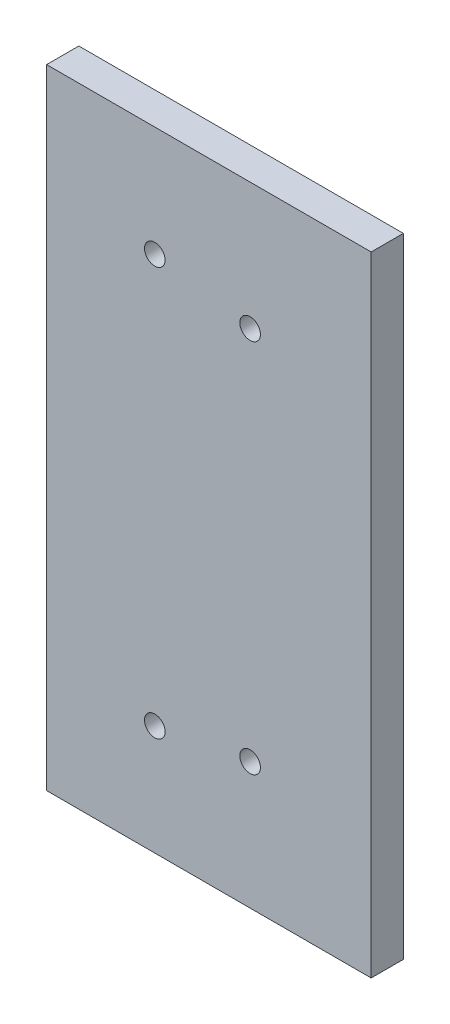
ISO-10303-21;
HEADER;
FILE_DESCRIPTION(('STEP AP214'),'2;1');
FILE_NAME('part.step','',(''),(''),'','','');
FILE_SCHEMA(('AUTOMOTIVE_DESIGN { 1 0 10303 214 1 1 1 1 }'));
ENDSEC;
DATA;
#1=APPLICATION_CONTEXT('core data for automotive mechanical design processes');
#2=APPLICATION_PROTOCOL_DEFINITION('international standard','automotive_design',2000,#1);
#3=PRODUCT_CONTEXT('',#1,'mechanical');
#4=PRODUCT('Part','Part','',(#3));
#5=PRODUCT_RELATED_PRODUCT_CATEGORY('part','',(#4));
#6=PRODUCT_DEFINITION_FORMATION('','',#4);
#7=PRODUCT_DEFINITION_CONTEXT('part definition',#1,'design');
#8=PRODUCT_DEFINITION('design','',#6,#7);
#9=PRODUCT_DEFINITION_SHAPE('','',#8);
#10=(LENGTH_UNIT() NAMED_UNIT(*) SI_UNIT(.MILLI.,.METRE.));
#11=(NAMED_UNIT(*) PLANE_ANGLE_UNIT() SI_UNIT($,.RADIAN.));
#12=(NAMED_UNIT(*) SI_UNIT($,.STERADIAN.) SOLID_ANGLE_UNIT());
#13=UNCERTAINTY_MEASURE_WITH_UNIT(LENGTH_MEASURE(1.E-05),#10,'distance_accuracy_value','');
#14=(GEOMETRIC_REPRESENTATION_CONTEXT(3) GLOBAL_UNCERTAINTY_ASSIGNED_CONTEXT((#13)) GLOBAL_UNIT_ASSIGNED_CONTEXT((#10,
#11,#12)) REPRESENTATION_CONTEXT('',''));
#15=CARTESIAN_POINT('',(0.,0.,0.));
#16=DIRECTION('',(0.,0.,1.));
#17=DIRECTION('',(1.,0.,0.));
#18=AXIS2_PLACEMENT_3D('',#15,#16,#17);
#19=CARTESIAN_POINT('',(0.,0.,1.5875));
#20=DIRECTION('',(0.,0.,1.));
#21=DIRECTION('',(1.,0.,0.));
#22=AXIS2_PLACEMENT_3D('',#19,#20,#21);
#23=PLANE('',#22);
#24=CARTESIAN_POINT('',(-2.667,-21.9289,1.5875));
#25=DIRECTION('',(0.,0.,-1.));
#26=DIRECTION('',(-1.,0.,0.));
#27=AXIS2_PLACEMENT_3D('',#24,#25,#26);
#28=CIRCLE('',#27,0.508);
#29=CARTESIAN_POINT('',(-2.159,-21.9289,1.5875));
#30=VERTEX_POINT('',#29);
#31=EDGE_CURVE('E26',#30,#30,#28,.T.);
#32=ORIENTED_EDGE('',*,*,#31,.T.);
#33=EDGE_LOOP('',(#32));
#34=FACE_BOUND('',#33,.T.);
#35=CARTESIAN_POINT('',(-2.667,-42.0711,1.5875));
#36=DIRECTION('',(0.,0.,-1.));
#37=DIRECTION('',(-1.,0.,0.));
#38=AXIS2_PLACEMENT_3D('',#35,#36,#37);
#39=CIRCLE('',#38,0.508);
#40=CARTESIAN_POINT('',(-2.159,-42.0711,1.5875));
#41=VERTEX_POINT('',#40);
#42=EDGE_CURVE('E106',#41,#41,#39,.T.);
#43=ORIENTED_EDGE('',*,*,#42,.T.);
#44=EDGE_LOOP('',(#43));
#45=FACE_BOUND('',#44,.T.);
#46=CARTESIAN_POINT('',(2.032,-22.7545,1.5875));
#47=DIRECTION('',(0.,0.,-1.));
#48=DIRECTION('',(-1.,0.,0.));
#49=AXIS2_PLACEMENT_3D('',#46,#47,#48);
#50=CIRCLE('',#49,0.508);
#51=CARTESIAN_POINT('',(2.54,-22.7545,1.5875));
#52=VERTEX_POINT('',#51);
#53=EDGE_CURVE('E103',#52,#52,#50,.T.);
#54=ORIENTED_EDGE('',*,*,#53,.T.);
#55=EDGE_LOOP('',(#54));
#56=FACE_BOUND('',#55,.T.);
#57=CARTESIAN_POINT('',(2.032,-41.2455,1.5875));
#58=DIRECTION('',(0.,0.,-1.));
#59=DIRECTION('',(-1.,0.,0.));
#60=AXIS2_PLACEMENT_3D('',#57,#58,#59);
#61=CIRCLE('',#60,0.508);
#62=CARTESIAN_POINT('',(2.54,-41.2455,1.5875));
#63=VERTEX_POINT('',#62);
#64=EDGE_CURVE('E107',#63,#63,#61,.T.);
#65=ORIENTED_EDGE('',*,*,#64,.T.);
#66=EDGE_LOOP('',(#65));
#67=FACE_BOUND('',#66,.T.);
#68=DIRECTION('',(0.,-1.,0.));
#69=VECTOR('',#68,1.);
#70=CARTESIAN_POINT('',(-8.,-23.75,1.5875));
#71=LINE('',#70,#69);
#72=CARTESIAN_POINT('',(-8.,-16.5,1.5875));
#73=VERTEX_POINT('',#72);
#74=CARTESIAN_POINT('',(-8.,-47.5,1.5875));
#75=VERTEX_POINT('',#74);
#76=EDGE_CURVE('E114',#73,#75,#71,.T.);
#77=ORIENTED_EDGE('',*,*,#76,.T.);
#78=DIRECTION('',(-1.,0.,0.));
#79=VECTOR('',#78,1.);
#80=CARTESIAN_POINT('',(47.5,-47.5,1.5875));
#81=LINE('',#80,#79);
#82=CARTESIAN_POINT('',(8.,-47.5,1.5875));
#83=VERTEX_POINT('',#82);
#84=EDGE_CURVE('E10',#83,#75,#81,.T.);
#85=ORIENTED_EDGE('',*,*,#84,.F.);
#86=DIRECTION('',(0.,1.,0.));
#87=VECTOR('',#86,1.);
#88=CARTESIAN_POINT('',(8.,-8.25,1.5875));
#89=LINE('',#88,#87);
#90=CARTESIAN_POINT('',(8.,-16.5,1.5875));
#91=VERTEX_POINT('',#90);
#92=EDGE_CURVE('E56',#83,#91,#89,.T.);
#93=ORIENTED_EDGE('',*,*,#92,.T.);
#94=DIRECTION('',(-1.,0.,0.));
#95=VECTOR('',#94,1.);
#96=CARTESIAN_POINT('',(-4.,-16.5,1.5875));
#97=LINE('',#96,#95);
#98=EDGE_CURVE('E101',#91,#73,#97,.T.);
#99=ORIENTED_EDGE('',*,*,#98,.T.);
#100=EDGE_LOOP('',(#77,#85,#93,#99));
#101=FACE_BOUND('',#100,.T.);
#102=ADVANCED_FACE('F15',(#34,#45,#56,#67,#101),#23,.T.);
#103=CARTESIAN_POINT('',(47.5,-47.5,0.));
#104=DIRECTION('',(0.,-1.,0.));
#105=DIRECTION('',(0.,0.,-1.));
#106=AXIS2_PLACEMENT_3D('',#103,#104,#105);
#107=PLANE('',#106);
#108=DIRECTION('',(0.,0.,-1.));
#109=VECTOR('',#108,1.);
#110=CARTESIAN_POINT('',(-8.,-47.5,0.79375));
#111=LINE('',#110,#109);
#112=CARTESIAN_POINT('',(-8.,-47.5,0.));
#113=VERTEX_POINT('',#112);
#114=EDGE_CURVE('E117',#75,#113,#111,.T.);
#115=ORIENTED_EDGE('',*,*,#114,.T.);
#116=DIRECTION('',(-1.,0.,0.));
#117=VECTOR('',#116,1.);
#118=CARTESIAN_POINT('',(47.5,-47.5,0.));
#119=LINE('',#118,#117);
#120=CARTESIAN_POINT('',(8.,-47.5,0.));
#121=VERTEX_POINT('',#120);
#122=EDGE_CURVE('E45',#121,#113,#119,.T.);
#123=ORIENTED_EDGE('',*,*,#122,.F.);
#124=DIRECTION('',(0.,0.,1.));
#125=VECTOR('',#124,1.);
#126=CARTESIAN_POINT('',(8.,-47.5,0.79375));
#127=LINE('',#126,#125);
#128=EDGE_CURVE('E92',#121,#83,#127,.T.);
#129=ORIENTED_EDGE('',*,*,#128,.T.);
#130=ORIENTED_EDGE('',*,*,#84,.T.);
#131=EDGE_LOOP('',(#115,#123,#129,#130));
#132=FACE_BOUND('',#131,.T.);
#133=ADVANCED_FACE('F142',(#132),#107,.T.);
#134=CARTESIAN_POINT('',(-2.667,-21.9289,1.5875));
#135=DIRECTION('',(0.,0.,1.));
#136=DIRECTION('',(-1.,0.,0.));
#137=AXIS2_PLACEMENT_3D('',#134,#135,#136);
#138=CYLINDRICAL_SURFACE('',#137,0.508);
#139=ORIENTED_EDGE('',*,*,#31,.F.);
#140=EDGE_LOOP('',(#139));
#141=FACE_BOUND('',#140,.T.);
#142=CARTESIAN_POINT('',(-2.667,-21.9289,0.));
#143=DIRECTION('',(0.,0.,1.));
#144=DIRECTION('',(-1.,0.,0.));
#145=AXIS2_PLACEMENT_3D('',#142,#143,#144);
#146=CIRCLE('',#145,0.508);
#147=CARTESIAN_POINT('',(-2.159,-21.9289,0.));
#148=VERTEX_POINT('',#147);
#149=EDGE_CURVE('E84',#148,#148,#146,.T.);
#150=ORIENTED_EDGE('',*,*,#149,.F.);
#151=EDGE_LOOP('',(#150));
#152=FACE_BOUND('',#151,.T.);
#153=ADVANCED_FACE('F146',(#141,#152),#138,.F.);
#154=CARTESIAN_POINT('',(-2.667,-42.0711,1.5875));
#155=DIRECTION('',(0.,0.,1.));
#156=DIRECTION('',(-1.,0.,0.));
#157=AXIS2_PLACEMENT_3D('',#154,#155,#156);
#158=CYLINDRICAL_SURFACE('',#157,0.508);
#159=ORIENTED_EDGE('',*,*,#42,.F.);
#160=EDGE_LOOP('',(#159));
#161=FACE_BOUND('',#160,.T.);
#162=CARTESIAN_POINT('',(-2.667,-42.0711,0.));
#163=DIRECTION('',(0.,0.,1.));
#164=DIRECTION('',(-1.,0.,0.));
#165=AXIS2_PLACEMENT_3D('',#162,#163,#164);
#166=CIRCLE('',#165,0.508);
#167=CARTESIAN_POINT('',(-2.159,-42.0711,0.));
#168=VERTEX_POINT('',#167);
#169=EDGE_CURVE('E78',#168,#168,#166,.T.);
#170=ORIENTED_EDGE('',*,*,#169,.F.);
#171=EDGE_LOOP('',(#170));
#172=FACE_BOUND('',#171,.T.);
#173=ADVANCED_FACE('F136',(#161,#172),#158,.F.);
#174=CARTESIAN_POINT('',(2.032,-22.7545,1.5875));
#175=DIRECTION('',(0.,0.,1.));
#176=DIRECTION('',(-1.,0.,0.));
#177=AXIS2_PLACEMENT_3D('',#174,#175,#176);
#178=CYLINDRICAL_SURFACE('',#177,0.508);
#179=ORIENTED_EDGE('',*,*,#53,.F.);
#180=EDGE_LOOP('',(#179));
#181=FACE_BOUND('',#180,.T.);
#182=CARTESIAN_POINT('',(2.032,-22.7545,0.));
#183=DIRECTION('',(0.,0.,1.));
#184=DIRECTION('',(-1.,0.,0.));
#185=AXIS2_PLACEMENT_3D('',#182,#183,#184);
#186=CIRCLE('',#185,0.508);
#187=CARTESIAN_POINT('',(2.54,-22.7545,0.));
#188=VERTEX_POINT('',#187);
#189=EDGE_CURVE('E89',#188,#188,#186,.T.);
#190=ORIENTED_EDGE('',*,*,#189,.F.);
#191=EDGE_LOOP('',(#190));
#192=FACE_BOUND('',#191,.T.);
#193=ADVANCED_FACE('F126',(#181,#192),#178,.F.);
#194=CARTESIAN_POINT('',(2.032,-41.2455,1.5875));
#195=DIRECTION('',(0.,0.,1.));
#196=DIRECTION('',(-1.,0.,0.));
#197=AXIS2_PLACEMENT_3D('',#194,#195,#196);
#198=CYLINDRICAL_SURFACE('',#197,0.508);
#199=ORIENTED_EDGE('',*,*,#64,.F.);
#200=EDGE_LOOP('',(#199));
#201=FACE_BOUND('',#200,.T.);
#202=CARTESIAN_POINT('',(2.032,-41.2455,0.));
#203=DIRECTION('',(0.,0.,1.));
#204=DIRECTION('',(-1.,0.,0.));
#205=AXIS2_PLACEMENT_3D('',#202,#203,#204);
#206=CIRCLE('',#205,0.508);
#207=CARTESIAN_POINT('',(2.54,-41.2455,0.));
#208=VERTEX_POINT('',#207);
#209=EDGE_CURVE('E19',#208,#208,#206,.T.);
#210=ORIENTED_EDGE('',*,*,#209,.F.);
#211=EDGE_LOOP('',(#210));
#212=FACE_BOUND('',#211,.T.);
#213=ADVANCED_FACE('F124',(#201,#212),#198,.F.);
#214=CARTESIAN_POINT('',(0.,0.,0.));
#215=DIRECTION('',(0.,0.,1.));
#216=DIRECTION('',(1.,0.,0.));
#217=AXIS2_PLACEMENT_3D('',#214,#215,#216);
#218=PLANE('',#217);
#219=ORIENTED_EDGE('',*,*,#209,.T.);
#220=EDGE_LOOP('',(#219));
#221=FACE_BOUND('',#220,.T.);
#222=ORIENTED_EDGE('',*,*,#189,.T.);
#223=EDGE_LOOP('',(#222));
#224=FACE_BOUND('',#223,.T.);
#225=ORIENTED_EDGE('',*,*,#169,.T.);
#226=EDGE_LOOP('',(#225));
#227=FACE_BOUND('',#226,.T.);
#228=ORIENTED_EDGE('',*,*,#149,.T.);
#229=EDGE_LOOP('',(#228));
#230=FACE_BOUND('',#229,.T.);
#231=DIRECTION('',(0.,1.,0.));
#232=VECTOR('',#231,1.);
#233=CARTESIAN_POINT('',(-8.,-23.75,0.));
#234=LINE('',#233,#232);
#235=CARTESIAN_POINT('',(-8.,-16.5,0.));
#236=VERTEX_POINT('',#235);
#237=EDGE_CURVE('E257',#113,#236,#234,.T.);
#238=ORIENTED_EDGE('',*,*,#237,.T.);
#239=DIRECTION('',(1.,0.,0.));
#240=VECTOR('',#239,1.);
#241=CARTESIAN_POINT('',(-4.,-16.5,0.));
#242=LINE('',#241,#240);
#243=CARTESIAN_POINT('',(8.,-16.5,0.));
#244=VERTEX_POINT('',#243);
#245=EDGE_CURVE('E98',#236,#244,#242,.T.);
#246=ORIENTED_EDGE('',*,*,#245,.T.);
#247=DIRECTION('',(0.,-1.,0.));
#248=VECTOR('',#247,1.);
#249=CARTESIAN_POINT('',(8.,-8.25,0.));
#250=LINE('',#249,#248);
#251=EDGE_CURVE('E109',#244,#121,#250,.T.);
#252=ORIENTED_EDGE('',*,*,#251,.T.);
#253=ORIENTED_EDGE('',*,*,#122,.T.);
#254=EDGE_LOOP('',(#238,#246,#252,#253));
#255=FACE_BOUND('',#254,.T.);
#256=ADVANCED_FACE('F85',(#221,#224,#227,#230,#255),#218,.F.);
#257=CARTESIAN_POINT('',(8.,-16.5,1.5875));
#258=DIRECTION('',(-1.,0.,0.));
#259=DIRECTION('',(0.,0.,1.));
#260=AXIS2_PLACEMENT_3D('',#257,#258,#259);
#261=PLANE('',#260);
#262=ORIENTED_EDGE('',*,*,#251,.F.);
#263=DIRECTION('',(0.,0.,-1.));
#264=VECTOR('',#263,1.);
#265=CARTESIAN_POINT('',(8.,-16.5,1.5875));
#266=LINE('',#265,#264);
#267=EDGE_CURVE('E96',#91,#244,#266,.T.);
#268=ORIENTED_EDGE('',*,*,#267,.F.);
#269=ORIENTED_EDGE('',*,*,#92,.F.);
#270=ORIENTED_EDGE('',*,*,#128,.F.);
#271=EDGE_LOOP('',(#262,#268,#269,#270));
#272=FACE_BOUND('',#271,.T.);
#273=ADVANCED_FACE('F134',(#272),#261,.F.);
#274=CARTESIAN_POINT('',(-8.,-16.5,1.5875));
#275=DIRECTION('',(0.,-1.,0.));
#276=DIRECTION('',(0.,0.,-1.));
#277=AXIS2_PLACEMENT_3D('',#274,#275,#276);
#278=PLANE('',#277);
#279=ORIENTED_EDGE('',*,*,#245,.F.);
#280=DIRECTION('',(0.,0.,-1.));
#281=VECTOR('',#280,1.);
#282=CARTESIAN_POINT('',(-8.,-16.5,1.5875));
#283=LINE('',#282,#281);
#284=EDGE_CURVE('E102',#73,#236,#283,.T.);
#285=ORIENTED_EDGE('',*,*,#284,.F.);
#286=ORIENTED_EDGE('',*,*,#98,.F.);
#287=ORIENTED_EDGE('',*,*,#267,.T.);
#288=EDGE_LOOP('',(#279,#285,#286,#287));
#289=FACE_BOUND('',#288,.T.);
#290=ADVANCED_FACE('F17',(#289),#278,.F.);
#291=CARTESIAN_POINT('',(-8.,-47.5,1.5875));
#292=DIRECTION('',(1.,0.,0.));
#293=DIRECTION('',(0.,0.,-1.));
#294=AXIS2_PLACEMENT_3D('',#291,#292,#293);
#295=PLANE('',#294);
#296=ORIENTED_EDGE('',*,*,#237,.F.);
#297=ORIENTED_EDGE('',*,*,#114,.F.);
#298=ORIENTED_EDGE('',*,*,#76,.F.);
#299=ORIENTED_EDGE('',*,*,#284,.T.);
#300=EDGE_LOOP('',(#296,#297,#298,#299));
#301=FACE_BOUND('',#300,.T.);
#302=ADVANCED_FACE('F149',(#301),#295,.F.);
#303=CLOSED_SHELL('',(#102,#133,#153,#173,#193,#213,#256,#273,#290,#302));
#304=MANIFOLD_SOLID_BREP('B1',#303);
#305=ADVANCED_BREP_SHAPE_REPRESENTATION('',(#18,#304),#14);
#306=SHAPE_DEFINITION_REPRESENTATION(#9,#305);
ENDSEC;
END-ISO-10303-21;
